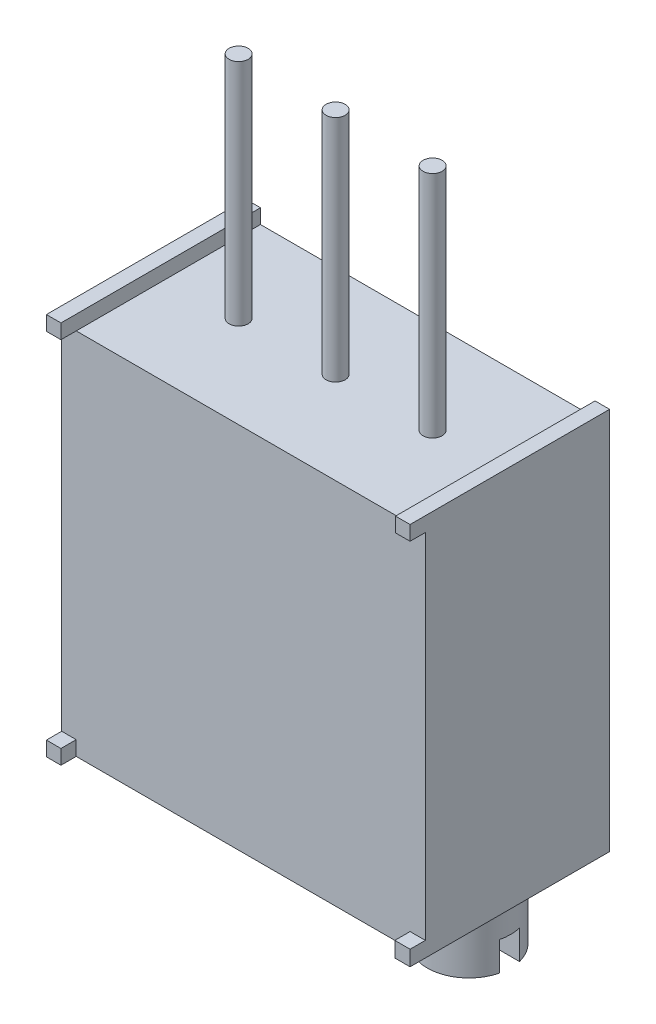
ISO-10303-21;
HEADER;
FILE_DESCRIPTION(('STEP AP214'),'2;1');
FILE_NAME('part.step','',(''),(''),'','','');
FILE_SCHEMA(('AUTOMOTIVE_DESIGN { 1 0 10303 214 1 1 1 1 }'));
ENDSEC;
DATA;
#1=APPLICATION_CONTEXT('core data for automotive mechanical design processes');
#2=APPLICATION_PROTOCOL_DEFINITION('international standard','automotive_design',2000,#1);
#3=PRODUCT_CONTEXT('',#1,'mechanical');
#4=PRODUCT('Part','Part','',(#3));
#5=PRODUCT_RELATED_PRODUCT_CATEGORY('part','',(#4));
#6=PRODUCT_DEFINITION_FORMATION('','',#4);
#7=PRODUCT_DEFINITION_CONTEXT('part definition',#1,'design');
#8=PRODUCT_DEFINITION('design','',#6,#7);
#9=PRODUCT_DEFINITION_SHAPE('','',#8);
#10=(LENGTH_UNIT() NAMED_UNIT(*) SI_UNIT(.MILLI.,.METRE.));
#11=(NAMED_UNIT(*) PLANE_ANGLE_UNIT() SI_UNIT($,.RADIAN.));
#12=(NAMED_UNIT(*) SI_UNIT($,.STERADIAN.) SOLID_ANGLE_UNIT());
#13=UNCERTAINTY_MEASURE_WITH_UNIT(LENGTH_MEASURE(1.E-05),#10,'distance_accuracy_value','');
#14=(GEOMETRIC_REPRESENTATION_CONTEXT(3) GLOBAL_UNCERTAINTY_ASSIGNED_CONTEXT((#13)) GLOBAL_UNIT_ASSIGNED_CONTEXT((#10,
#11,#12)) REPRESENTATION_CONTEXT('',''));
#15=CARTESIAN_POINT('',(0.,0.,0.));
#16=DIRECTION('',(0.,0.,1.));
#17=DIRECTION('',(1.,0.,0.));
#18=AXIS2_PLACEMENT_3D('',#15,#16,#17);
#19=CARTESIAN_POINT('',(6.0325,-11.176,0.));
#20=DIRECTION('',(0.,-1.,0.));
#21=DIRECTION('',(0.,0.,-1.));
#22=AXIS2_PLACEMENT_3D('',#19,#20,#21);
#23=PLANE('',#22);
#24=DIRECTION('',(-1.,0.,0.));
#25=VECTOR('',#24,1.);
#26=CARTESIAN_POINT('',(6.0325,-11.176,0.263250536035835));
#27=LINE('',#26,#25);
#28=CARTESIAN_POINT('',(7.0924999977721,-11.176,0.263250536035835));
#29=VERTEX_POINT('',#28);
#30=CARTESIAN_POINT('',(4.9725000022279,-11.176,0.263250536035835));
#31=VERTEX_POINT('',#30);
#32=EDGE_CURVE('E181',#29,#31,#27,.T.);
#33=ORIENTED_EDGE('',*,*,#32,.F.);
#34=CARTESIAN_POINT('',(6.0325,-11.176,0.));
#35=DIRECTION('',(0.,-1.,0.));
#36=DIRECTION('',(0.,0.,-1.));
#37=AXIS2_PLACEMENT_3D('',#34,#35,#36);
#38=CIRCLE('',#37,1.0922);
#39=EDGE_CURVE('E194',#29,#31,#38,.T.);
#40=ORIENTED_EDGE('',*,*,#39,.T.);
#41=EDGE_LOOP('',(#33,#40));
#42=FACE_BOUND('',#41,.T.);
#43=ADVANCED_FACE('F33',(#42),#23,.T.);
#44=CARTESIAN_POINT('',(0.,-9.652,0.));
#45=DIRECTION('',(0.,1.,0.));
#46=DIRECTION('',(0.,0.,1.));
#47=AXIS2_PLACEMENT_3D('',#44,#45,#46);
#48=PLANE('',#47);
#49=DIRECTION('',(0.,0.,1.));
#50=VECTOR('',#49,1.);
#51=CARTESIAN_POINT('',(-2.2225,-9.652,2.413));
#52=LINE('',#51,#50);
#53=CARTESIAN_POINT('',(-2.2225,-9.652,-2.413));
#54=VERTEX_POINT('',#53);
#55=CARTESIAN_POINT('',(-2.2225,-9.652,2.813));
#56=VERTEX_POINT('',#55);
#57=EDGE_CURVE('E322',#54,#56,#52,.T.);
#58=ORIENTED_EDGE('',*,*,#57,.F.);
#59=DIRECTION('',(-1.,0.,0.));
#60=VECTOR('',#59,1.);
#61=CARTESIAN_POINT('',(7.3025,-9.652,-2.413));
#62=LINE('',#61,#60);
#63=CARTESIAN_POINT('',(7.3025,-9.652,-2.413));
#64=VERTEX_POINT('',#63);
#65=EDGE_CURVE('E330',#64,#54,#62,.T.);
#66=ORIENTED_EDGE('',*,*,#65,.F.);
#67=DIRECTION('',(0.,0.,-1.));
#68=VECTOR('',#67,1.);
#69=CARTESIAN_POINT('',(7.3025,-9.652,2.413));
#70=LINE('',#69,#68);
#71=CARTESIAN_POINT('',(7.3025,-9.652,2.813));
#72=VERTEX_POINT('',#71);
#73=EDGE_CURVE('E327',#72,#64,#70,.T.);
#74=ORIENTED_EDGE('',*,*,#73,.F.);
#75=DIRECTION('',(1.,0.,0.));
#76=VECTOR('',#75,1.);
#77=CARTESIAN_POINT('',(7.3025,-9.652,2.813));
#78=LINE('',#77,#76);
#79=CARTESIAN_POINT('',(6.9025,-9.652,2.813));
#80=VERTEX_POINT('',#79);
#81=EDGE_CURVE('E210',#80,#72,#78,.T.);
#82=ORIENTED_EDGE('',*,*,#81,.F.);
#83=DIRECTION('',(0.,0.,-1.));
#84=VECTOR('',#83,1.);
#85=CARTESIAN_POINT('',(6.9025,-9.652,2.813));
#86=LINE('',#85,#84);
#87=CARTESIAN_POINT('',(6.9025,-9.652,2.413));
#88=VERTEX_POINT('',#87);
#89=EDGE_CURVE('E213',#80,#88,#86,.T.);
#90=ORIENTED_EDGE('',*,*,#89,.T.);
#91=DIRECTION('',(1.,0.,0.));
#92=VECTOR('',#91,1.);
#93=CARTESIAN_POINT('',(7.3025,-9.652,2.413));
#94=LINE('',#93,#92);
#95=CARTESIAN_POINT('',(-1.8415,-9.652,2.413));
#96=VERTEX_POINT('',#95);
#97=EDGE_CURVE('E324',#96,#88,#94,.T.);
#98=ORIENTED_EDGE('',*,*,#97,.F.);
#99=DIRECTION('',(0.,0.,-1.));
#100=VECTOR('',#99,1.);
#101=CARTESIAN_POINT('',(-1.8415,-9.652,2.813));
#102=LINE('',#101,#100);
#103=CARTESIAN_POINT('',(-1.8415,-9.652,2.813));
#104=VERTEX_POINT('',#103);
#105=EDGE_CURVE('E245',#104,#96,#102,.T.);
#106=ORIENTED_EDGE('',*,*,#105,.F.);
#107=DIRECTION('',(1.,0.,0.));
#108=VECTOR('',#107,1.);
#109=CARTESIAN_POINT('',(-2.2225,-9.652,2.813));
#110=LINE('',#109,#108);
#111=EDGE_CURVE('E228',#56,#104,#110,.T.);
#112=ORIENTED_EDGE('',*,*,#111,.F.);
#113=EDGE_LOOP('',(#58,#66,#74,#82,#90,#98,#106,#112));
#114=FACE_BOUND('',#113,.T.);
#115=CARTESIAN_POINT('',(6.0325,-9.652,0.));
#116=DIRECTION('',(0.,1.,0.));
#117=DIRECTION('',(0.,0.,1.));
#118=AXIS2_PLACEMENT_3D('',#115,#116,#117);
#119=CIRCLE('',#118,1.0922);
#120=CARTESIAN_POINT('',(6.0325,-9.652,1.0922));
#121=VERTEX_POINT('',#120);
#122=EDGE_CURVE('E182',#121,#121,#119,.F.);
#123=ORIENTED_EDGE('',*,*,#122,.F.);
#124=EDGE_LOOP('',(#123));
#125=FACE_BOUND('',#124,.T.);
#126=ADVANCED_FACE('F368',(#114,#125),#48,.F.);
#127=CARTESIAN_POINT('',(7.3025,-9.652,2.413));
#128=DIRECTION('',(0.,0.,1.));
#129=DIRECTION('',(1.,0.,0.));
#130=AXIS2_PLACEMENT_3D('',#127,#128,#129);
#131=PLANE('',#130);
#132=DIRECTION('',(0.,-1.,0.));
#133=VECTOR('',#132,1.);
#134=CARTESIAN_POINT('',(6.9025,-9.652,2.413));
#135=LINE('',#134,#133);
#136=CARTESIAN_POINT('',(6.9025,-9.252,2.413));
#137=VERTEX_POINT('',#136);
#138=EDGE_CURVE('E56',#137,#88,#135,.T.);
#139=ORIENTED_EDGE('',*,*,#138,.F.);
#140=DIRECTION('',(-1.,0.,0.));
#141=VECTOR('',#140,1.);
#142=CARTESIAN_POINT('',(7.3025,-9.252,2.413));
#143=LINE('',#142,#141);
#144=CARTESIAN_POINT('',(7.3025,-9.252,2.413));
#145=VERTEX_POINT('',#144);
#146=EDGE_CURVE('E198',#145,#137,#143,.T.);
#147=ORIENTED_EDGE('',*,*,#146,.F.);
#148=DIRECTION('',(0.,1.,0.));
#149=VECTOR('',#148,1.);
#150=CARTESIAN_POINT('',(7.3025,-9.652,2.413));
#151=LINE('',#150,#149);
#152=CARTESIAN_POINT('',(7.3025,0.,2.413));
#153=VERTEX_POINT('',#152);
#154=EDGE_CURVE('E342',#145,#153,#151,.T.);
#155=ORIENTED_EDGE('',*,*,#154,.T.);
#156=DIRECTION('',(1.,0.,0.));
#157=VECTOR('',#156,1.);
#158=CARTESIAN_POINT('',(7.3025,0.,2.413));
#159=LINE('',#158,#157);
#160=CARTESIAN_POINT('',(6.9215,0.,2.413));
#161=VERTEX_POINT('',#160);
#162=EDGE_CURVE('E248',#161,#153,#159,.T.);
#163=ORIENTED_EDGE('',*,*,#162,.F.);
#164=DIRECTION('',(1.,0.,0.));
#165=VECTOR('',#164,1.);
#166=CARTESIAN_POINT('',(7.3025,0.,2.413));
#167=LINE('',#166,#165);
#168=CARTESIAN_POINT('',(-1.8415,0.,2.413));
#169=VERTEX_POINT('',#168);
#170=EDGE_CURVE('E319',#169,#161,#167,.T.);
#171=ORIENTED_EDGE('',*,*,#170,.F.);
#172=DIRECTION('',(1.,0.,0.));
#173=VECTOR('',#172,1.);
#174=CARTESIAN_POINT('',(-1.8415,0.,2.413));
#175=LINE('',#174,#173);
#176=CARTESIAN_POINT('',(-2.2225,0.,2.413));
#177=VERTEX_POINT('',#176);
#178=EDGE_CURVE('E267',#177,#169,#175,.T.);
#179=ORIENTED_EDGE('',*,*,#178,.F.);
#180=DIRECTION('',(0.,1.,0.));
#181=VECTOR('',#180,1.);
#182=CARTESIAN_POINT('',(-2.2225,-9.652,2.413));
#183=LINE('',#182,#181);
#184=CARTESIAN_POINT('',(-2.2225,-9.271,2.413));
#185=VERTEX_POINT('',#184);
#186=EDGE_CURVE('E333',#185,#177,#183,.T.);
#187=ORIENTED_EDGE('',*,*,#186,.F.);
#188=DIRECTION('',(-1.,0.,0.));
#189=VECTOR('',#188,1.);
#190=CARTESIAN_POINT('',(-2.2225,-9.271,2.413));
#191=LINE('',#190,#189);
#192=CARTESIAN_POINT('',(-1.8415,-9.271,2.413));
#193=VERTEX_POINT('',#192);
#194=EDGE_CURVE('E229',#193,#185,#191,.T.);
#195=ORIENTED_EDGE('',*,*,#194,.F.);
#196=DIRECTION('',(0.,1.,0.));
#197=VECTOR('',#196,1.);
#198=CARTESIAN_POINT('',(-1.8415,-9.652,2.413));
#199=LINE('',#198,#197);
#200=EDGE_CURVE('E224',#96,#193,#199,.T.);
#201=ORIENTED_EDGE('',*,*,#200,.F.);
#202=ORIENTED_EDGE('',*,*,#97,.T.);
#203=EDGE_LOOP('',(#139,#147,#155,#163,#171,#179,#187,#195,#201,#202));
#204=FACE_BOUND('',#203,.T.);
#205=ADVANCED_FACE('F373',(#204),#131,.T.);
#206=CARTESIAN_POINT('',(0.,0.,0.));
#207=DIRECTION('',(0.,1.,0.));
#208=DIRECTION('',(0.,0.,1.));
#209=AXIS2_PLACEMENT_3D('',#206,#207,#208);
#210=PLANE('',#209);
#211=CARTESIAN_POINT('',(2.54,0.,0.));
#212=DIRECTION('',(0.,1.,0.));
#213=DIRECTION('',(0.,0.,1.));
#214=AXIS2_PLACEMENT_3D('',#211,#212,#213);
#215=CIRCLE('',#214,0.25);
#216=CARTESIAN_POINT('',(2.54,0.,0.25));
#217=VERTEX_POINT('',#216);
#218=EDGE_CURVE('E313',#217,#217,#215,.T.);
#219=ORIENTED_EDGE('',*,*,#218,.F.);
#220=EDGE_LOOP('',(#219));
#221=FACE_BOUND('',#220,.T.);
#222=CARTESIAN_POINT('',(0.,0.,0.));
#223=DIRECTION('',(0.,1.,0.));
#224=DIRECTION('',(0.,0.,1.));
#225=AXIS2_PLACEMENT_3D('',#222,#223,#224);
#226=CIRCLE('',#225,0.25);
#227=CARTESIAN_POINT('',(0.,0.,0.25));
#228=VERTEX_POINT('',#227);
#229=EDGE_CURVE('E339',#228,#228,#226,.T.);
#230=ORIENTED_EDGE('',*,*,#229,.F.);
#231=EDGE_LOOP('',(#230));
#232=FACE_BOUND('',#231,.T.);
#233=CARTESIAN_POINT('',(5.08,0.,0.));
#234=DIRECTION('',(0.,1.,0.));
#235=DIRECTION('',(0.,0.,1.));
#236=AXIS2_PLACEMENT_3D('',#233,#234,#235);
#237=CIRCLE('',#236,0.25);
#238=CARTESIAN_POINT('',(5.08,0.,0.25));
#239=VERTEX_POINT('',#238);
#240=EDGE_CURVE('E309',#239,#239,#237,.T.);
#241=ORIENTED_EDGE('',*,*,#240,.F.);
#242=EDGE_LOOP('',(#241));
#243=FACE_BOUND('',#242,.T.);
#244=ORIENTED_EDGE('',*,*,#170,.T.);
#245=DIRECTION('',(0.,0.,1.));
#246=VECTOR('',#245,1.);
#247=CARTESIAN_POINT('',(6.9215,0.,-2.413));
#248=LINE('',#247,#246);
#249=CARTESIAN_POINT('',(6.9215,0.,-2.413));
#250=VERTEX_POINT('',#249);
#251=EDGE_CURVE('E283',#250,#161,#248,.T.);
#252=ORIENTED_EDGE('',*,*,#251,.F.);
#253=DIRECTION('',(-1.,0.,0.));
#254=VECTOR('',#253,1.);
#255=CARTESIAN_POINT('',(7.3025,0.,-2.413));
#256=LINE('',#255,#254);
#257=CARTESIAN_POINT('',(-1.8415,0.,-2.413));
#258=VERTEX_POINT('',#257);
#259=EDGE_CURVE('E325',#250,#258,#256,.T.);
#260=ORIENTED_EDGE('',*,*,#259,.T.);
#261=DIRECTION('',(0.,0.,-1.));
#262=VECTOR('',#261,1.);
#263=CARTESIAN_POINT('',(-1.8415,0.,-2.413));
#264=LINE('',#263,#262);
#265=EDGE_CURVE('E296',#169,#258,#264,.T.);
#266=ORIENTED_EDGE('',*,*,#265,.F.);
#267=EDGE_LOOP('',(#244,#252,#260,#266));
#268=FACE_BOUND('',#267,.T.);
#269=ADVANCED_FACE('F461',(#221,#232,#243,#268),#210,.T.);
#270=CARTESIAN_POINT('',(0.,6.,0.));
#271=DIRECTION('',(0.,-1.,0.));
#272=DIRECTION('',(0.,0.,-1.));
#273=AXIS2_PLACEMENT_3D('',#270,#271,#272);
#274=CYLINDRICAL_SURFACE('',#273,0.25);
#275=CARTESIAN_POINT('',(0.,6.,0.));
#276=DIRECTION('',(0.,1.,0.));
#277=DIRECTION('',(0.,0.,1.));
#278=AXIS2_PLACEMENT_3D('',#275,#276,#277);
#279=CIRCLE('',#278,0.25);
#280=CARTESIAN_POINT('',(0.,6.,0.25));
#281=VERTEX_POINT('',#280);
#282=EDGE_CURVE('E353',#281,#281,#279,.T.);
#283=ORIENTED_EDGE('',*,*,#282,.F.);
#284=EDGE_LOOP('',(#283));
#285=FACE_BOUND('',#284,.T.);
#286=ORIENTED_EDGE('',*,*,#229,.T.);
#287=EDGE_LOOP('',(#286));
#288=FACE_BOUND('',#287,.T.);
#289=ADVANCED_FACE('F35',(#285,#288),#274,.T.);
#290=CARTESIAN_POINT('',(0.,6.,0.));
#291=DIRECTION('',(0.,1.,0.));
#292=DIRECTION('',(0.,0.,1.));
#293=AXIS2_PLACEMENT_3D('',#290,#291,#292);
#294=PLANE('',#293);
#295=ORIENTED_EDGE('',*,*,#282,.T.);
#296=EDGE_LOOP('',(#295));
#297=FACE_BOUND('',#296,.T.);
#298=ADVANCED_FACE('F476',(#297),#294,.T.);
#299=CARTESIAN_POINT('',(-2.2225,-9.652,2.413));
#300=DIRECTION('',(-1.,0.,0.));
#301=DIRECTION('',(0.,0.,1.));
#302=AXIS2_PLACEMENT_3D('',#299,#300,#301);
#303=PLANE('',#302);
#304=ORIENTED_EDGE('',*,*,#57,.T.);
#305=DIRECTION('',(0.,-1.,0.));
#306=VECTOR('',#305,1.);
#307=CARTESIAN_POINT('',(-2.2225,-9.652,2.813));
#308=LINE('',#307,#306);
#309=CARTESIAN_POINT('',(-2.2225,-9.271,2.813));
#310=VERTEX_POINT('',#309);
#311=EDGE_CURVE('E225',#310,#56,#308,.T.);
#312=ORIENTED_EDGE('',*,*,#311,.F.);
#313=DIRECTION('',(0.,0.,-1.));
#314=VECTOR('',#313,1.);
#315=CARTESIAN_POINT('',(-2.2225,-9.271,2.813));
#316=LINE('',#315,#314);
#317=EDGE_CURVE('E235',#310,#185,#316,.T.);
#318=ORIENTED_EDGE('',*,*,#317,.T.);
#319=ORIENTED_EDGE('',*,*,#186,.T.);
#320=DIRECTION('',(0.,0.,-1.));
#321=VECTOR('',#320,1.);
#322=CARTESIAN_POINT('',(-2.2225,0.,2.813));
#323=LINE('',#322,#321);
#324=CARTESIAN_POINT('',(-2.2225,0.,2.813));
#325=VERTEX_POINT('',#324);
#326=EDGE_CURVE('E279',#325,#177,#323,.T.);
#327=ORIENTED_EDGE('',*,*,#326,.F.);
#328=DIRECTION('',(0.,-1.,0.));
#329=VECTOR('',#328,1.);
#330=CARTESIAN_POINT('',(-2.2225,0.381,2.813));
#331=LINE('',#330,#329);
#332=CARTESIAN_POINT('',(-2.2225,0.381,2.813));
#333=VERTEX_POINT('',#332);
#334=EDGE_CURVE('E277',#333,#325,#331,.T.);
#335=ORIENTED_EDGE('',*,*,#334,.F.);
#336=DIRECTION('',(0.,0.,1.));
#337=VECTOR('',#336,1.);
#338=CARTESIAN_POINT('',(-2.2225,0.381,-2.413));
#339=LINE('',#338,#337);
#340=CARTESIAN_POINT('',(-2.2225,0.381,-2.413));
#341=VERTEX_POINT('',#340);
#342=EDGE_CURVE('E297',#341,#333,#339,.T.);
#343=ORIENTED_EDGE('',*,*,#342,.F.);
#344=DIRECTION('',(0.,1.,0.));
#345=VECTOR('',#344,1.);
#346=CARTESIAN_POINT('',(-2.2225,-9.652,-2.413));
#347=LINE('',#346,#345);
#348=EDGE_CURVE('E337',#54,#341,#347,.T.);
#349=ORIENTED_EDGE('',*,*,#348,.F.);
#350=EDGE_LOOP('',(#304,#312,#318,#319,#327,#335,#343,#349));
#351=FACE_BOUND('',#350,.T.);
#352=ADVANCED_FACE('F468',(#351),#303,.T.);
#353=CARTESIAN_POINT('',(7.3025,-9.652,-2.413));
#354=DIRECTION('',(0.,0.,-1.));
#355=DIRECTION('',(-1.,0.,0.));
#356=AXIS2_PLACEMENT_3D('',#353,#354,#355);
#357=PLANE('',#356);
#358=ORIENTED_EDGE('',*,*,#259,.F.);
#359=DIRECTION('',(0.,-1.,0.));
#360=VECTOR('',#359,1.);
#361=CARTESIAN_POINT('',(6.9215,0.381,-2.413));
#362=LINE('',#361,#360);
#363=CARTESIAN_POINT('',(6.9215,0.381,-2.413));
#364=VERTEX_POINT('',#363);
#365=EDGE_CURVE('E291',#364,#250,#362,.T.);
#366=ORIENTED_EDGE('',*,*,#365,.F.);
#367=DIRECTION('',(-1.,0.,0.));
#368=VECTOR('',#367,1.);
#369=CARTESIAN_POINT('',(6.9215,0.381,-2.413));
#370=LINE('',#369,#368);
#371=CARTESIAN_POINT('',(7.3025,0.381,-2.413));
#372=VERTEX_POINT('',#371);
#373=EDGE_CURVE('E289',#372,#364,#370,.T.);
#374=ORIENTED_EDGE('',*,*,#373,.F.);
#375=DIRECTION('',(0.,1.,0.));
#376=VECTOR('',#375,1.);
#377=CARTESIAN_POINT('',(7.3025,-9.652,-2.413));
#378=LINE('',#377,#376);
#379=EDGE_CURVE('E340',#64,#372,#378,.T.);
#380=ORIENTED_EDGE('',*,*,#379,.F.);
#381=ORIENTED_EDGE('',*,*,#65,.T.);
#382=ORIENTED_EDGE('',*,*,#348,.T.);
#383=DIRECTION('',(-1.,0.,0.));
#384=VECTOR('',#383,1.);
#385=CARTESIAN_POINT('',(-1.8415,0.381,-2.413));
#386=LINE('',#385,#384);
#387=CARTESIAN_POINT('',(-1.8415,0.381,-2.413));
#388=VERTEX_POINT('',#387);
#389=EDGE_CURVE('E301',#388,#341,#386,.T.);
#390=ORIENTED_EDGE('',*,*,#389,.F.);
#391=DIRECTION('',(0.,-1.,0.));
#392=VECTOR('',#391,1.);
#393=CARTESIAN_POINT('',(-1.8415,0.381,-2.413));
#394=LINE('',#393,#392);
#395=EDGE_CURVE('E304',#388,#258,#394,.T.);
#396=ORIENTED_EDGE('',*,*,#395,.T.);
#397=EDGE_LOOP('',(#358,#366,#374,#380,#381,#382,#390,#396));
#398=FACE_BOUND('',#397,.T.);
#399=ADVANCED_FACE('F465',(#398),#357,.T.);
#400=CARTESIAN_POINT('',(7.3025,-9.652,2.413));
#401=DIRECTION('',(1.,0.,0.));
#402=DIRECTION('',(0.,0.,-1.));
#403=AXIS2_PLACEMENT_3D('',#400,#401,#402);
#404=PLANE('',#403);
#405=ORIENTED_EDGE('',*,*,#379,.T.);
#406=DIRECTION('',(0.,0.,-1.));
#407=VECTOR('',#406,1.);
#408=CARTESIAN_POINT('',(7.3025,0.381,-2.413));
#409=LINE('',#408,#407);
#410=CARTESIAN_POINT('',(7.3025,0.381,2.813));
#411=VERTEX_POINT('',#410);
#412=EDGE_CURVE('E286',#411,#372,#409,.T.);
#413=ORIENTED_EDGE('',*,*,#412,.F.);
#414=DIRECTION('',(0.,1.,0.));
#415=VECTOR('',#414,1.);
#416=CARTESIAN_POINT('',(7.3025,0.381,2.813));
#417=LINE('',#416,#415);
#418=CARTESIAN_POINT('',(7.3025,0.,2.813));
#419=VERTEX_POINT('',#418);
#420=EDGE_CURVE('E254',#419,#411,#417,.T.);
#421=ORIENTED_EDGE('',*,*,#420,.F.);
#422=DIRECTION('',(0.,0.,-1.));
#423=VECTOR('',#422,1.);
#424=CARTESIAN_POINT('',(7.3025,0.,2.813));
#425=LINE('',#424,#423);
#426=EDGE_CURVE('E260',#419,#153,#425,.T.);
#427=ORIENTED_EDGE('',*,*,#426,.T.);
#428=ORIENTED_EDGE('',*,*,#154,.F.);
#429=DIRECTION('',(0.,0.,-1.));
#430=VECTOR('',#429,1.);
#431=CARTESIAN_POINT('',(7.3025,-9.252,2.813));
#432=LINE('',#431,#430);
#433=CARTESIAN_POINT('',(7.3025,-9.252,2.813));
#434=VERTEX_POINT('',#433);
#435=EDGE_CURVE('E221',#434,#145,#432,.T.);
#436=ORIENTED_EDGE('',*,*,#435,.F.);
#437=DIRECTION('',(0.,1.,0.));
#438=VECTOR('',#437,1.);
#439=CARTESIAN_POINT('',(7.3025,-9.652,2.813));
#440=LINE('',#439,#438);
#441=EDGE_CURVE('E203',#72,#434,#440,.T.);
#442=ORIENTED_EDGE('',*,*,#441,.F.);
#443=ORIENTED_EDGE('',*,*,#73,.T.);
#444=EDGE_LOOP('',(#405,#413,#421,#427,#428,#436,#442,#443));
#445=FACE_BOUND('',#444,.T.);
#446=ADVANCED_FACE('F458',(#445),#404,.T.);
#447=CARTESIAN_POINT('',(2.54,6.,0.));
#448=DIRECTION('',(0.,-1.,0.));
#449=DIRECTION('',(0.,0.,-1.));
#450=AXIS2_PLACEMENT_3D('',#447,#448,#449);
#451=CYLINDRICAL_SURFACE('',#450,0.25);
#452=CARTESIAN_POINT('',(2.54,6.,0.));
#453=DIRECTION('',(0.,1.,0.));
#454=DIRECTION('',(0.,0.,1.));
#455=AXIS2_PLACEMENT_3D('',#452,#453,#454);
#456=CIRCLE('',#455,0.25);
#457=CARTESIAN_POINT('',(2.54,6.,0.25));
#458=VERTEX_POINT('',#457);
#459=EDGE_CURVE('E316',#458,#458,#456,.T.);
#460=ORIENTED_EDGE('',*,*,#459,.F.);
#461=EDGE_LOOP('',(#460));
#462=FACE_BOUND('',#461,.T.);
#463=ORIENTED_EDGE('',*,*,#218,.T.);
#464=EDGE_LOOP('',(#463));
#465=FACE_BOUND('',#464,.T.);
#466=ADVANCED_FACE('F455',(#462,#465),#451,.T.);
#467=CARTESIAN_POINT('',(2.54,6.,0.));
#468=DIRECTION('',(0.,1.,0.));
#469=DIRECTION('',(0.,0.,1.));
#470=AXIS2_PLACEMENT_3D('',#467,#468,#469);
#471=PLANE('',#470);
#472=ORIENTED_EDGE('',*,*,#459,.T.);
#473=EDGE_LOOP('',(#472));
#474=FACE_BOUND('',#473,.T.);
#475=ADVANCED_FACE('F451',(#474),#471,.T.);
#476=CARTESIAN_POINT('',(5.08,6.,0.));
#477=DIRECTION('',(0.,-1.,0.));
#478=DIRECTION('',(0.,0.,-1.));
#479=AXIS2_PLACEMENT_3D('',#476,#477,#478);
#480=CYLINDRICAL_SURFACE('',#479,0.25);
#481=CARTESIAN_POINT('',(5.08,6.,0.));
#482=DIRECTION('',(0.,1.,0.));
#483=DIRECTION('',(0.,0.,1.));
#484=AXIS2_PLACEMENT_3D('',#481,#482,#483);
#485=CIRCLE('',#484,0.25);
#486=CARTESIAN_POINT('',(5.08,6.,0.25));
#487=VERTEX_POINT('',#486);
#488=EDGE_CURVE('E310',#487,#487,#485,.T.);
#489=ORIENTED_EDGE('',*,*,#488,.F.);
#490=EDGE_LOOP('',(#489));
#491=FACE_BOUND('',#490,.T.);
#492=ORIENTED_EDGE('',*,*,#240,.T.);
#493=EDGE_LOOP('',(#492));
#494=FACE_BOUND('',#493,.T.);
#495=ADVANCED_FACE('F447',(#491,#494),#480,.T.);
#496=CARTESIAN_POINT('',(5.08,6.,0.));
#497=DIRECTION('',(0.,1.,0.));
#498=DIRECTION('',(0.,0.,1.));
#499=AXIS2_PLACEMENT_3D('',#496,#497,#498);
#500=PLANE('',#499);
#501=ORIENTED_EDGE('',*,*,#488,.T.);
#502=EDGE_LOOP('',(#501));
#503=FACE_BOUND('',#502,.T.);
#504=ADVANCED_FACE('F443',(#503),#500,.T.);
#505=CARTESIAN_POINT('',(-1.8415,0.381,-2.413));
#506=DIRECTION('',(-1.,0.,0.));
#507=DIRECTION('',(0.,0.,1.));
#508=AXIS2_PLACEMENT_3D('',#505,#506,#507);
#509=PLANE('',#508);
#510=ORIENTED_EDGE('',*,*,#265,.T.);
#511=ORIENTED_EDGE('',*,*,#395,.F.);
#512=DIRECTION('',(0.,0.,-1.));
#513=VECTOR('',#512,1.);
#514=CARTESIAN_POINT('',(-1.8415,0.381,-2.413));
#515=LINE('',#514,#513);
#516=CARTESIAN_POINT('',(-1.8415,0.381,2.813));
#517=VERTEX_POINT('',#516);
#518=EDGE_CURVE('E299',#517,#388,#515,.T.);
#519=ORIENTED_EDGE('',*,*,#518,.F.);
#520=DIRECTION('',(0.,1.,0.));
#521=VECTOR('',#520,1.);
#522=CARTESIAN_POINT('',(-1.8415,0.381,2.813));
#523=LINE('',#522,#521);
#524=CARTESIAN_POINT('',(-1.8415,0.,2.813));
#525=VERTEX_POINT('',#524);
#526=EDGE_CURVE('E271',#525,#517,#523,.T.);
#527=ORIENTED_EDGE('',*,*,#526,.F.);
#528=DIRECTION('',(0.,0.,-1.));
#529=VECTOR('',#528,1.);
#530=CARTESIAN_POINT('',(-1.8415,0.,2.813));
#531=LINE('',#530,#529);
#532=EDGE_CURVE('E280',#525,#169,#531,.T.);
#533=ORIENTED_EDGE('',*,*,#532,.T.);
#534=EDGE_LOOP('',(#510,#511,#519,#527,#533));
#535=FACE_BOUND('',#534,.T.);
#536=ADVANCED_FACE('F439',(#535),#509,.F.);
#537=CARTESIAN_POINT('',(0.,0.381,0.));
#538=DIRECTION('',(0.,-1.,0.));
#539=DIRECTION('',(0.,0.,-1.));
#540=AXIS2_PLACEMENT_3D('',#537,#538,#539);
#541=PLANE('',#540);
#542=ORIENTED_EDGE('',*,*,#342,.T.);
#543=DIRECTION('',(-1.,0.,0.));
#544=VECTOR('',#543,1.);
#545=CARTESIAN_POINT('',(-1.8415,0.381,2.813));
#546=LINE('',#545,#544);
#547=EDGE_CURVE('E274',#517,#333,#546,.T.);
#548=ORIENTED_EDGE('',*,*,#547,.F.);
#549=ORIENTED_EDGE('',*,*,#518,.T.);
#550=ORIENTED_EDGE('',*,*,#389,.T.);
#551=EDGE_LOOP('',(#542,#548,#549,#550));
#552=FACE_BOUND('',#551,.T.);
#553=ADVANCED_FACE('F435',(#552),#541,.F.);
#554=CARTESIAN_POINT('',(6.9215,0.381,-2.413));
#555=DIRECTION('',(1.,0.,0.));
#556=DIRECTION('',(0.,0.,-1.));
#557=AXIS2_PLACEMENT_3D('',#554,#555,#556);
#558=PLANE('',#557);
#559=ORIENTED_EDGE('',*,*,#251,.T.);
#560=DIRECTION('',(0.,0.,-1.));
#561=VECTOR('',#560,1.);
#562=CARTESIAN_POINT('',(6.9215,0.,2.813));
#563=LINE('',#562,#561);
#564=CARTESIAN_POINT('',(6.9215,0.,2.813));
#565=VERTEX_POINT('',#564);
#566=EDGE_CURVE('E265',#565,#161,#563,.T.);
#567=ORIENTED_EDGE('',*,*,#566,.F.);
#568=DIRECTION('',(0.,-1.,0.));
#569=VECTOR('',#568,1.);
#570=CARTESIAN_POINT('',(6.9215,0.381,2.813));
#571=LINE('',#570,#569);
#572=CARTESIAN_POINT('',(6.9215,0.381,2.813));
#573=VERTEX_POINT('',#572);
#574=EDGE_CURVE('E249',#573,#565,#571,.T.);
#575=ORIENTED_EDGE('',*,*,#574,.F.);
#576=DIRECTION('',(0.,0.,1.));
#577=VECTOR('',#576,1.);
#578=CARTESIAN_POINT('',(6.9215,0.381,-2.413));
#579=LINE('',#578,#577);
#580=EDGE_CURVE('E284',#364,#573,#579,.T.);
#581=ORIENTED_EDGE('',*,*,#580,.F.);
#582=ORIENTED_EDGE('',*,*,#365,.T.);
#583=EDGE_LOOP('',(#559,#567,#575,#581,#582));
#584=FACE_BOUND('',#583,.T.);
#585=ADVANCED_FACE('F431',(#584),#558,.F.);
#586=CARTESIAN_POINT('',(0.,0.381,0.));
#587=DIRECTION('',(0.,1.,0.));
#588=DIRECTION('',(0.,0.,1.));
#589=AXIS2_PLACEMENT_3D('',#586,#587,#588);
#590=PLANE('',#589);
#591=ORIENTED_EDGE('',*,*,#580,.T.);
#592=DIRECTION('',(-1.,0.,0.));
#593=VECTOR('',#592,1.);
#594=CARTESIAN_POINT('',(7.3025,0.381,2.813));
#595=LINE('',#594,#593);
#596=EDGE_CURVE('E257',#411,#573,#595,.T.);
#597=ORIENTED_EDGE('',*,*,#596,.F.);
#598=ORIENTED_EDGE('',*,*,#412,.T.);
#599=ORIENTED_EDGE('',*,*,#373,.T.);
#600=EDGE_LOOP('',(#591,#597,#598,#599));
#601=FACE_BOUND('',#600,.T.);
#602=ADVANCED_FACE('F427',(#601),#590,.T.);
#603=CARTESIAN_POINT('',(-1.8415,0.,2.813));
#604=DIRECTION('',(0.,1.,0.));
#605=DIRECTION('',(-1.,0.,0.));
#606=AXIS2_PLACEMENT_3D('',#603,#604,#605);
#607=PLANE('',#606);
#608=ORIENTED_EDGE('',*,*,#178,.T.);
#609=ORIENTED_EDGE('',*,*,#532,.F.);
#610=DIRECTION('',(1.,0.,0.));
#611=VECTOR('',#610,1.);
#612=CARTESIAN_POINT('',(-1.8415,0.,2.813));
#613=LINE('',#612,#611);
#614=EDGE_CURVE('E268',#325,#525,#613,.T.);
#615=ORIENTED_EDGE('',*,*,#614,.F.);
#616=ORIENTED_EDGE('',*,*,#326,.T.);
#617=EDGE_LOOP('',(#608,#609,#615,#616));
#618=FACE_BOUND('',#617,.T.);
#619=ADVANCED_FACE('F423',(#618),#607,.F.);
#620=CARTESIAN_POINT('',(0.,0.,2.813));
#621=DIRECTION('',(0.,0.,1.));
#622=DIRECTION('',(1.,0.,0.));
#623=AXIS2_PLACEMENT_3D('',#620,#621,#622);
#624=PLANE('',#623);
#625=ORIENTED_EDGE('',*,*,#614,.T.);
#626=ORIENTED_EDGE('',*,*,#526,.T.);
#627=ORIENTED_EDGE('',*,*,#547,.T.);
#628=ORIENTED_EDGE('',*,*,#334,.T.);
#629=EDGE_LOOP('',(#625,#626,#627,#628));
#630=FACE_BOUND('',#629,.T.);
#631=ADVANCED_FACE('F419',(#630),#624,.T.);
#632=CARTESIAN_POINT('',(7.3025,0.,2.813));
#633=DIRECTION('',(0.,1.,0.));
#634=DIRECTION('',(0.,0.,1.));
#635=AXIS2_PLACEMENT_3D('',#632,#633,#634);
#636=PLANE('',#635);
#637=ORIENTED_EDGE('',*,*,#162,.T.);
#638=ORIENTED_EDGE('',*,*,#426,.F.);
#639=DIRECTION('',(1.,0.,0.));
#640=VECTOR('',#639,1.);
#641=CARTESIAN_POINT('',(7.3025,0.,2.813));
#642=LINE('',#641,#640);
#643=EDGE_CURVE('E252',#565,#419,#642,.T.);
#644=ORIENTED_EDGE('',*,*,#643,.F.);
#645=ORIENTED_EDGE('',*,*,#566,.T.);
#646=EDGE_LOOP('',(#637,#638,#644,#645));
#647=FACE_BOUND('',#646,.T.);
#648=ADVANCED_FACE('F415',(#647),#636,.F.);
#649=CARTESIAN_POINT('',(0.,0.,2.813));
#650=DIRECTION('',(0.,0.,-1.));
#651=DIRECTION('',(-1.,0.,0.));
#652=AXIS2_PLACEMENT_3D('',#649,#650,#651);
#653=PLANE('',#652);
#654=ORIENTED_EDGE('',*,*,#574,.T.);
#655=ORIENTED_EDGE('',*,*,#643,.T.);
#656=ORIENTED_EDGE('',*,*,#420,.T.);
#657=ORIENTED_EDGE('',*,*,#596,.T.);
#658=EDGE_LOOP('',(#654,#655,#656,#657));
#659=FACE_BOUND('',#658,.T.);
#660=ADVANCED_FACE('F411',(#659),#653,.F.);
#661=CARTESIAN_POINT('',(-1.8415,-9.652,2.813));
#662=DIRECTION('',(-1.,0.,0.));
#663=DIRECTION('',(0.,0.,1.));
#664=AXIS2_PLACEMENT_3D('',#661,#662,#663);
#665=PLANE('',#664);
#666=ORIENTED_EDGE('',*,*,#200,.T.);
#667=DIRECTION('',(0.,0.,-1.));
#668=VECTOR('',#667,1.);
#669=CARTESIAN_POINT('',(-1.8415,-9.271,2.813));
#670=LINE('',#669,#668);
#671=CARTESIAN_POINT('',(-1.8415,-9.271,2.813));
#672=VERTEX_POINT('',#671);
#673=EDGE_CURVE('E242',#672,#193,#670,.T.);
#674=ORIENTED_EDGE('',*,*,#673,.F.);
#675=DIRECTION('',(0.,1.,0.));
#676=VECTOR('',#675,1.);
#677=CARTESIAN_POINT('',(-1.8415,-9.652,2.813));
#678=LINE('',#677,#676);
#679=EDGE_CURVE('E231',#104,#672,#678,.T.);
#680=ORIENTED_EDGE('',*,*,#679,.F.);
#681=ORIENTED_EDGE('',*,*,#105,.T.);
#682=EDGE_LOOP('',(#666,#674,#680,#681));
#683=FACE_BOUND('',#682,.T.);
#684=ADVANCED_FACE('F407',(#683),#665,.F.);
#685=CARTESIAN_POINT('',(-2.2225,-9.271,2.813));
#686=DIRECTION('',(0.,-1.,0.));
#687=DIRECTION('',(0.,0.,-1.));
#688=AXIS2_PLACEMENT_3D('',#685,#686,#687);
#689=PLANE('',#688);
#690=ORIENTED_EDGE('',*,*,#194,.T.);
#691=ORIENTED_EDGE('',*,*,#317,.F.);
#692=DIRECTION('',(-1.,0.,0.));
#693=VECTOR('',#692,1.);
#694=CARTESIAN_POINT('',(-2.2225,-9.271,2.813));
#695=LINE('',#694,#693);
#696=EDGE_CURVE('E233',#672,#310,#695,.T.);
#697=ORIENTED_EDGE('',*,*,#696,.F.);
#698=ORIENTED_EDGE('',*,*,#673,.T.);
#699=EDGE_LOOP('',(#690,#691,#697,#698));
#700=FACE_BOUND('',#699,.T.);
#701=ADVANCED_FACE('F403',(#700),#689,.F.);
#702=CARTESIAN_POINT('',(0.,0.,2.813));
#703=DIRECTION('',(0.,0.,-1.));
#704=DIRECTION('',(-1.,0.,0.));
#705=AXIS2_PLACEMENT_3D('',#702,#703,#704);
#706=PLANE('',#705);
#707=ORIENTED_EDGE('',*,*,#311,.T.);
#708=ORIENTED_EDGE('',*,*,#111,.T.);
#709=ORIENTED_EDGE('',*,*,#679,.T.);
#710=ORIENTED_EDGE('',*,*,#696,.T.);
#711=EDGE_LOOP('',(#707,#708,#709,#710));
#712=FACE_BOUND('',#711,.T.);
#713=ADVANCED_FACE('F399',(#712),#706,.F.);
#714=CARTESIAN_POINT('',(7.3025,-9.252,2.813));
#715=DIRECTION('',(0.,-1.,0.));
#716=DIRECTION('',(1.,0.,0.));
#717=AXIS2_PLACEMENT_3D('',#714,#715,#716);
#718=PLANE('',#717);
#719=ORIENTED_EDGE('',*,*,#146,.T.);
#720=DIRECTION('',(0.,0.,-1.));
#721=VECTOR('',#720,1.);
#722=CARTESIAN_POINT('',(6.9025,-9.252,2.813));
#723=LINE('',#722,#721);
#724=CARTESIAN_POINT('',(6.9025,-9.252,2.813));
#725=VERTEX_POINT('',#724);
#726=EDGE_CURVE('E218',#725,#137,#723,.T.);
#727=ORIENTED_EDGE('',*,*,#726,.F.);
#728=DIRECTION('',(-1.,0.,0.));
#729=VECTOR('',#728,1.);
#730=CARTESIAN_POINT('',(7.3025,-9.252,2.813));
#731=LINE('',#730,#729);
#732=EDGE_CURVE('E206',#434,#725,#731,.T.);
#733=ORIENTED_EDGE('',*,*,#732,.F.);
#734=ORIENTED_EDGE('',*,*,#435,.T.);
#735=EDGE_LOOP('',(#719,#727,#733,#734));
#736=FACE_BOUND('',#735,.T.);
#737=ADVANCED_FACE('F395',(#736),#718,.F.);
#738=CARTESIAN_POINT('',(6.9025,-9.652,2.813));
#739=DIRECTION('',(1.,0.,0.));
#740=DIRECTION('',(0.,0.,-1.));
#741=AXIS2_PLACEMENT_3D('',#738,#739,#740);
#742=PLANE('',#741);
#743=ORIENTED_EDGE('',*,*,#138,.T.);
#744=ORIENTED_EDGE('',*,*,#89,.F.);
#745=DIRECTION('',(0.,-1.,0.));
#746=VECTOR('',#745,1.);
#747=CARTESIAN_POINT('',(6.9025,-9.652,2.813));
#748=LINE('',#747,#746);
#749=EDGE_CURVE('E208',#725,#80,#748,.T.);
#750=ORIENTED_EDGE('',*,*,#749,.F.);
#751=ORIENTED_EDGE('',*,*,#726,.T.);
#752=EDGE_LOOP('',(#743,#744,#750,#751));
#753=FACE_BOUND('',#752,.T.);
#754=ADVANCED_FACE('F389',(#753),#742,.F.);
#755=CARTESIAN_POINT('',(0.,0.,2.813));
#756=DIRECTION('',(0.,0.,1.));
#757=DIRECTION('',(1.,0.,0.));
#758=AXIS2_PLACEMENT_3D('',#755,#756,#757);
#759=PLANE('',#758);
#760=ORIENTED_EDGE('',*,*,#441,.T.);
#761=ORIENTED_EDGE('',*,*,#732,.T.);
#762=ORIENTED_EDGE('',*,*,#749,.T.);
#763=ORIENTED_EDGE('',*,*,#81,.T.);
#764=EDGE_LOOP('',(#760,#761,#762,#763));
#765=FACE_BOUND('',#764,.T.);
#766=ADVANCED_FACE('F385',(#765),#759,.T.);
#767=CARTESIAN_POINT('',(6.0325,-11.176,0.));
#768=DIRECTION('',(0.,1.,0.));
#769=DIRECTION('',(0.,0.,1.));
#770=AXIS2_PLACEMENT_3D('',#767,#768,#769);
#771=CYLINDRICAL_SURFACE('',#770,1.0922);
#772=ORIENTED_EDGE('',*,*,#39,.F.);
#773=DIRECTION('',(0.,1.,0.));
#774=VECTOR('',#773,1.);
#775=CARTESIAN_POINT('',(7.0924999977721,-11.176,0.263250536035835));
#776=LINE('',#775,#774);
#777=CARTESIAN_POINT('',(7.0924999977721,-10.414,0.263250536035835));
#778=VERTEX_POINT('',#777);
#779=EDGE_CURVE('E195',#29,#778,#776,.T.);
#780=ORIENTED_EDGE('',*,*,#779,.T.);
#781=CARTESIAN_POINT('',(6.0325,-10.414,0.));
#782=DIRECTION('',(0.,-1.,0.));
#783=DIRECTION('',(0.,0.,-1.));
#784=AXIS2_PLACEMENT_3D('',#781,#782,#783);
#785=CIRCLE('',#784,1.0922);
#786=CARTESIAN_POINT('',(7.0924999977721,-10.414,-0.263250536035834));
#787=VERTEX_POINT('',#786);
#788=EDGE_CURVE('E11',#787,#778,#785,.T.);
#789=ORIENTED_EDGE('',*,*,#788,.F.);
#790=DIRECTION('',(0.,1.,0.));
#791=VECTOR('',#790,1.);
#792=CARTESIAN_POINT('',(7.0924999977721,-11.176,-0.263250536035834));
#793=LINE('',#792,#791);
#794=CARTESIAN_POINT('',(7.0924999977721,-11.176,-0.263250536035834));
#795=VERTEX_POINT('',#794);
#796=EDGE_CURVE('E176',#787,#795,#793,.F.);
#797=ORIENTED_EDGE('',*,*,#796,.T.);
#798=CARTESIAN_POINT('',(4.9725000022279,-11.176,-0.263250536035834));
#799=VERTEX_POINT('',#798);
#800=EDGE_CURVE('E189',#799,#795,#38,.T.);
#801=ORIENTED_EDGE('',*,*,#800,.F.);
#802=DIRECTION('',(0.,1.,0.));
#803=VECTOR('',#802,1.);
#804=CARTESIAN_POINT('',(4.9725000022279,-11.176,-0.263250536035834));
#805=LINE('',#804,#803);
#806=CARTESIAN_POINT('',(4.9725000022279,-10.414,-0.263250536035834));
#807=VERTEX_POINT('',#806);
#808=EDGE_CURVE('E48',#799,#807,#805,.T.);
#809=ORIENTED_EDGE('',*,*,#808,.T.);
#810=CARTESIAN_POINT('',(4.9725000022279,-10.414,0.263250536035835));
#811=VERTEX_POINT('',#810);
#812=EDGE_CURVE('E37',#811,#807,#785,.T.);
#813=ORIENTED_EDGE('',*,*,#812,.F.);
#814=DIRECTION('',(0.,1.,0.));
#815=VECTOR('',#814,1.);
#816=CARTESIAN_POINT('',(4.9725000022279,-11.176,0.263250536035835));
#817=LINE('',#816,#815);
#818=EDGE_CURVE('E199',#811,#31,#817,.F.);
#819=ORIENTED_EDGE('',*,*,#818,.T.);
#820=EDGE_LOOP('',(#772,#780,#789,#797,#801,#809,#813,#819));
#821=FACE_BOUND('',#820,.T.);
#822=ORIENTED_EDGE('',*,*,#122,.T.);
#823=EDGE_LOOP('',(#822));
#824=FACE_BOUND('',#823,.T.);
#825=ADVANCED_FACE('F187',(#821,#824),#771,.T.);
#826=DIRECTION('',(1.,0.,0.));
#827=VECTOR('',#826,1.);
#828=CARTESIAN_POINT('',(6.0325,-11.176,-0.263250536035834));
#829=LINE('',#828,#827);
#830=EDGE_CURVE('E173',#799,#795,#829,.T.);
#831=ORIENTED_EDGE('',*,*,#830,.F.);
#832=ORIENTED_EDGE('',*,*,#800,.T.);
#833=EDGE_LOOP('',(#831,#832));
#834=FACE_BOUND('',#833,.T.);
#835=ADVANCED_FACE('F193',(#834),#23,.T.);
#836=CARTESIAN_POINT('',(0.,-10.414,0.));
#837=DIRECTION('',(0.,-1.,0.));
#838=DIRECTION('',(0.,0.,-1.));
#839=AXIS2_PLACEMENT_3D('',#836,#837,#838);
#840=PLANE('',#839);
#841=ORIENTED_EDGE('',*,*,#788,.T.);
#842=DIRECTION('',(-1.,0.,0.));
#843=VECTOR('',#842,1.);
#844=CARTESIAN_POINT('',(7.28853337439721,-10.414,0.263250536035835));
#845=LINE('',#844,#843);
#846=EDGE_CURVE('E191',#778,#811,#845,.T.);
#847=ORIENTED_EDGE('',*,*,#846,.T.);
#848=ORIENTED_EDGE('',*,*,#812,.T.);
#849=DIRECTION('',(1.,0.,0.));
#850=VECTOR('',#849,1.);
#851=CARTESIAN_POINT('',(7.28853337439721,-10.414,-0.263250536035834));
#852=LINE('',#851,#850);
#853=EDGE_CURVE('E361',#807,#787,#852,.T.);
#854=ORIENTED_EDGE('',*,*,#853,.T.);
#855=EDGE_LOOP('',(#841,#847,#848,#854));
#856=FACE_BOUND('',#855,.T.);
#857=ADVANCED_FACE('F360',(#856),#840,.T.);
#858=CARTESIAN_POINT('',(7.28853337439721,-10.414,0.263250536035835));
#859=DIRECTION('',(0.,0.,1.));
#860=DIRECTION('',(1.,0.,0.));
#861=AXIS2_PLACEMENT_3D('',#858,#859,#860);
#862=PLANE('',#861);
#863=ORIENTED_EDGE('',*,*,#32,.T.);
#864=ORIENTED_EDGE('',*,*,#818,.F.);
#865=ORIENTED_EDGE('',*,*,#846,.F.);
#866=ORIENTED_EDGE('',*,*,#779,.F.);
#867=EDGE_LOOP('',(#863,#864,#865,#866));
#868=FACE_BOUND('',#867,.T.);
#869=ADVANCED_FACE('F383',(#868),#862,.F.);
#870=CARTESIAN_POINT('',(7.28853337439721,-10.414,-0.263250536035834));
#871=DIRECTION('',(0.,0.,-1.));
#872=DIRECTION('',(-1.,0.,0.));
#873=AXIS2_PLACEMENT_3D('',#870,#871,#872);
#874=PLANE('',#873);
#875=ORIENTED_EDGE('',*,*,#830,.T.);
#876=ORIENTED_EDGE('',*,*,#796,.F.);
#877=ORIENTED_EDGE('',*,*,#853,.F.);
#878=ORIENTED_EDGE('',*,*,#808,.F.);
#879=EDGE_LOOP('',(#875,#876,#877,#878));
#880=FACE_BOUND('',#879,.T.);
#881=ADVANCED_FACE('F175',(#880),#874,.F.);
#882=CLOSED_SHELL('',(#43,#126,#205,#269,#289,#298,#352,#399,#446,#466,#475,#495,#504,#536,#553,
#585,#602,#619,#631,#648,#660,#684,#701,#713,#737,#754,#766,#825,#835,#857,#869,#881));
#883=MANIFOLD_SOLID_BREP('B2',#882);
#884=ADVANCED_BREP_SHAPE_REPRESENTATION('',(#18,#883),#14);
#885=SHAPE_DEFINITION_REPRESENTATION(#9,#884);
ENDSEC;
END-ISO-10303-21;
